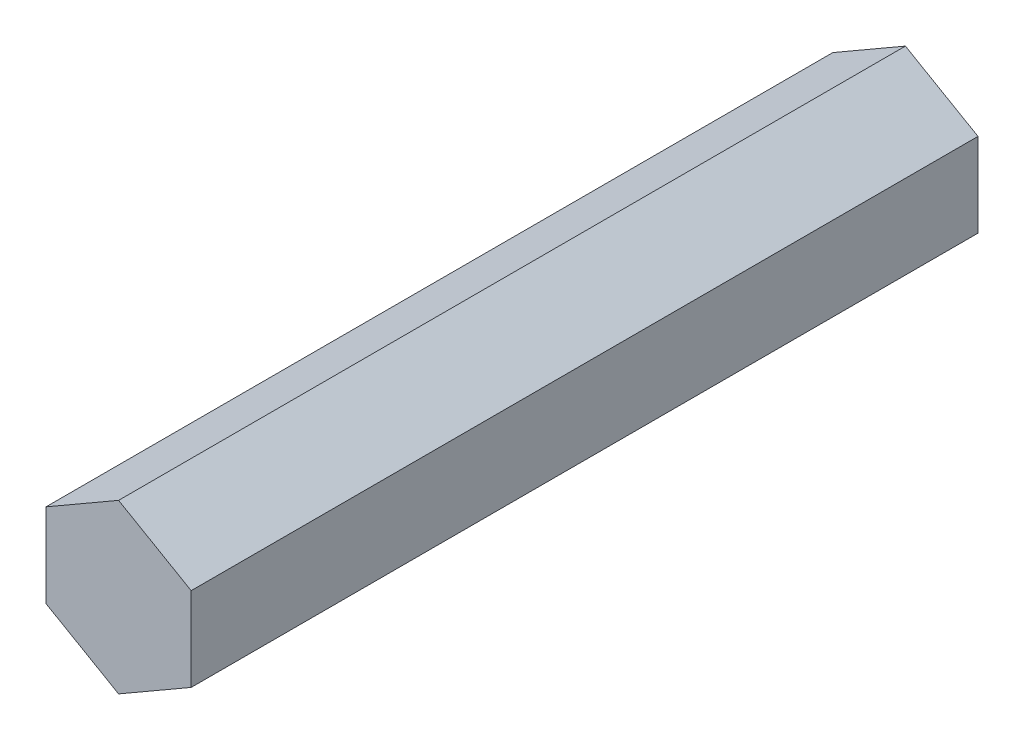
ISO-10303-21;
HEADER;
FILE_DESCRIPTION(('STEP AP214'),'2;1');
FILE_NAME('part.step','',(''),(''),'','','');
FILE_SCHEMA(('AUTOMOTIVE_DESIGN { 1 0 10303 214 1 1 1 1 }'));
ENDSEC;
DATA;
#1=APPLICATION_CONTEXT('core data for automotive mechanical design processes');
#2=APPLICATION_PROTOCOL_DEFINITION('international standard','automotive_design',2000,#1);
#3=PRODUCT_CONTEXT('',#1,'mechanical');
#4=PRODUCT('Part','Part','',(#3));
#5=PRODUCT_RELATED_PRODUCT_CATEGORY('part','',(#4));
#6=PRODUCT_DEFINITION_FORMATION('','',#4);
#7=PRODUCT_DEFINITION_CONTEXT('part definition',#1,'design');
#8=PRODUCT_DEFINITION('design','',#6,#7);
#9=PRODUCT_DEFINITION_SHAPE('','',#8);
#10=(LENGTH_UNIT() NAMED_UNIT(*) SI_UNIT(.MILLI.,.METRE.));
#11=(NAMED_UNIT(*) PLANE_ANGLE_UNIT() SI_UNIT($,.RADIAN.));
#12=(NAMED_UNIT(*) SI_UNIT($,.STERADIAN.) SOLID_ANGLE_UNIT());
#13=UNCERTAINTY_MEASURE_WITH_UNIT(LENGTH_MEASURE(1.E-05),#10,'distance_accuracy_value','');
#14=(GEOMETRIC_REPRESENTATION_CONTEXT(3) GLOBAL_UNCERTAINTY_ASSIGNED_CONTEXT((#13)) GLOBAL_UNIT_ASSIGNED_CONTEXT((#10,
#11,#12)) REPRESENTATION_CONTEXT('',''));
#15=CARTESIAN_POINT('',(0.,0.,0.));
#16=DIRECTION('',(0.,0.,1.));
#17=DIRECTION('',(1.,0.,0.));
#18=AXIS2_PLACEMENT_3D('',#15,#16,#17);
#19=CARTESIAN_POINT('',(0.,7.33234841870825,34.417));
#20=DIRECTION('',(0.5,-0.866025403784439,0.));
#21=DIRECTION('',(0.866025403784439,0.5,0.));
#22=AXIS2_PLACEMENT_3D('',#19,#20,#21);
#23=PLANE('',#22);
#24=DIRECTION('',(-0.866025403784439,-0.5,0.));
#25=VECTOR('',#24,1.);
#26=CARTESIAN_POINT('',(0.,7.33234841870825,-34.417));
#27=LINE('',#26,#25);
#28=CARTESIAN_POINT('',(0.,7.33234841870825,-34.417));
#29=VERTEX_POINT('',#28);
#30=CARTESIAN_POINT('',(-6.35,3.66617420935413,-34.417));
#31=VERTEX_POINT('',#30);
#32=EDGE_CURVE('E140',#29,#31,#27,.T.);
#33=ORIENTED_EDGE('',*,*,#32,.T.);
#34=DIRECTION('',(0.,0.,-1.));
#35=VECTOR('',#34,1.);
#36=CARTESIAN_POINT('',(-6.35,3.66617420935413,34.417));
#37=LINE('',#36,#35);
#38=CARTESIAN_POINT('',(-6.35,3.66617420935413,34.417));
#39=VERTEX_POINT('',#38);
#40=EDGE_CURVE('E11',#39,#31,#37,.T.);
#41=ORIENTED_EDGE('',*,*,#40,.F.);
#42=DIRECTION('',(-0.866025403784439,-0.5,0.));
#43=VECTOR('',#42,1.);
#44=CARTESIAN_POINT('',(0.,7.33234841870825,34.417));
#45=LINE('',#44,#43);
#46=CARTESIAN_POINT('',(0.,7.33234841870825,34.417));
#47=VERTEX_POINT('',#46);
#48=EDGE_CURVE('E153',#47,#39,#45,.T.);
#49=ORIENTED_EDGE('',*,*,#48,.F.);
#50=DIRECTION('',(0.,0.,-1.));
#51=VECTOR('',#50,1.);
#52=CARTESIAN_POINT('',(0.,7.33234841870825,34.417));
#53=LINE('',#52,#51);
#54=EDGE_CURVE('E136',#47,#29,#53,.T.);
#55=ORIENTED_EDGE('',*,*,#54,.T.);
#56=EDGE_LOOP('',(#33,#41,#49,#55));
#57=FACE_BOUND('',#56,.T.);
#58=ADVANCED_FACE('F41',(#57),#23,.F.);
#59=CARTESIAN_POINT('',(-6.35,3.66617420935413,34.417));
#60=DIRECTION('',(1.,0.,0.));
#61=DIRECTION('',(0.,1.,0.));
#62=AXIS2_PLACEMENT_3D('',#59,#60,#61);
#63=PLANE('',#62);
#64=DIRECTION('',(0.,-1.,0.));
#65=VECTOR('',#64,1.);
#66=CARTESIAN_POINT('',(-6.35,3.66617420935413,-34.417));
#67=LINE('',#66,#65);
#68=CARTESIAN_POINT('',(-6.35,-3.66617420935412,-34.417));
#69=VERTEX_POINT('',#68);
#70=EDGE_CURVE('E144',#31,#69,#67,.T.);
#71=ORIENTED_EDGE('',*,*,#70,.T.);
#72=DIRECTION('',(0.,0.,-1.));
#73=VECTOR('',#72,1.);
#74=CARTESIAN_POINT('',(-6.35,-3.66617420935412,34.417));
#75=LINE('',#74,#73);
#76=CARTESIAN_POINT('',(-6.35,-3.66617420935412,34.417));
#77=VERTEX_POINT('',#76);
#78=EDGE_CURVE('E50',#77,#69,#75,.T.);
#79=ORIENTED_EDGE('',*,*,#78,.F.);
#80=DIRECTION('',(0.,-1.,0.));
#81=VECTOR('',#80,1.);
#82=CARTESIAN_POINT('',(-6.35,3.66617420935413,34.417));
#83=LINE('',#82,#81);
#84=EDGE_CURVE('E104',#39,#77,#83,.T.);
#85=ORIENTED_EDGE('',*,*,#84,.F.);
#86=ORIENTED_EDGE('',*,*,#40,.T.);
#87=EDGE_LOOP('',(#71,#79,#85,#86));
#88=FACE_BOUND('',#87,.T.);
#89=ADVANCED_FACE('F181',(#88),#63,.F.);
#90=CARTESIAN_POINT('',(-6.35,-3.66617420935412,34.417));
#91=DIRECTION('',(0.5,0.866025403784439,0.));
#92=DIRECTION('',(-0.866025403784439,0.5,0.));
#93=AXIS2_PLACEMENT_3D('',#90,#91,#92);
#94=PLANE('',#93);
#95=DIRECTION('',(0.866025403784439,-0.5,0.));
#96=VECTOR('',#95,1.);
#97=CARTESIAN_POINT('',(-6.35,-3.66617420935412,-34.417));
#98=LINE('',#97,#96);
#99=CARTESIAN_POINT('',(0.,-7.33234841870825,-34.417));
#100=VERTEX_POINT('',#99);
#101=EDGE_CURVE('E146',#69,#100,#98,.T.);
#102=ORIENTED_EDGE('',*,*,#101,.T.);
#103=DIRECTION('',(0.,0.,-1.));
#104=VECTOR('',#103,1.);
#105=CARTESIAN_POINT('',(0.,-7.33234841870825,34.417));
#106=LINE('',#105,#104);
#107=CARTESIAN_POINT('',(0.,-7.33234841870825,34.417));
#108=VERTEX_POINT('',#107);
#109=EDGE_CURVE('E128',#108,#100,#106,.T.);
#110=ORIENTED_EDGE('',*,*,#109,.F.);
#111=DIRECTION('',(0.866025403784439,-0.5,0.));
#112=VECTOR('',#111,1.);
#113=CARTESIAN_POINT('',(-6.35,-3.66617420935412,34.417));
#114=LINE('',#113,#112);
#115=EDGE_CURVE('E117',#77,#108,#114,.T.);
#116=ORIENTED_EDGE('',*,*,#115,.F.);
#117=ORIENTED_EDGE('',*,*,#78,.T.);
#118=EDGE_LOOP('',(#102,#110,#116,#117));
#119=FACE_BOUND('',#118,.T.);
#120=ADVANCED_FACE('F163',(#119),#94,.F.);
#121=CARTESIAN_POINT('',(0.,-7.33234841870825,34.417));
#122=DIRECTION('',(-0.5,0.866025403784439,0.));
#123=DIRECTION('',(-0.866025403784439,-0.5,0.));
#124=AXIS2_PLACEMENT_3D('',#121,#122,#123);
#125=PLANE('',#124);
#126=DIRECTION('',(0.866025403784439,0.5,0.));
#127=VECTOR('',#126,1.);
#128=CARTESIAN_POINT('',(0.,-7.33234841870825,-34.417));
#129=LINE('',#128,#127);
#130=CARTESIAN_POINT('',(6.35,-3.66617420935413,-34.417));
#131=VERTEX_POINT('',#130);
#132=EDGE_CURVE('E126',#100,#131,#129,.T.);
#133=ORIENTED_EDGE('',*,*,#132,.T.);
#134=DIRECTION('',(0.,0.,-1.));
#135=VECTOR('',#134,1.);
#136=CARTESIAN_POINT('',(6.35,-3.66617420935413,34.417));
#137=LINE('',#136,#135);
#138=CARTESIAN_POINT('',(6.35,-3.66617420935413,34.417));
#139=VERTEX_POINT('',#138);
#140=EDGE_CURVE('E123',#139,#131,#137,.T.);
#141=ORIENTED_EDGE('',*,*,#140,.F.);
#142=DIRECTION('',(0.866025403784439,0.5,0.));
#143=VECTOR('',#142,1.);
#144=CARTESIAN_POINT('',(0.,-7.33234841870825,34.417));
#145=LINE('',#144,#143);
#146=EDGE_CURVE('E111',#108,#139,#145,.T.);
#147=ORIENTED_EDGE('',*,*,#146,.F.);
#148=ORIENTED_EDGE('',*,*,#109,.T.);
#149=EDGE_LOOP('',(#133,#141,#147,#148));
#150=FACE_BOUND('',#149,.T.);
#151=ADVANCED_FACE('F124',(#150),#125,.F.);
#152=CARTESIAN_POINT('',(6.35,-3.66617420935413,34.417));
#153=DIRECTION('',(-1.,0.,0.));
#154=DIRECTION('',(0.,0.,1.));
#155=AXIS2_PLACEMENT_3D('',#152,#153,#154);
#156=PLANE('',#155);
#157=DIRECTION('',(0.,1.,0.));
#158=VECTOR('',#157,1.);
#159=CARTESIAN_POINT('',(6.35,-3.66617420935413,-34.417));
#160=LINE('',#159,#158);
#161=CARTESIAN_POINT('',(6.35,3.66617420935412,-34.417));
#162=VERTEX_POINT('',#161);
#163=EDGE_CURVE('E88',#131,#162,#160,.T.);
#164=ORIENTED_EDGE('',*,*,#163,.T.);
#165=DIRECTION('',(0.,0.,-1.));
#166=VECTOR('',#165,1.);
#167=CARTESIAN_POINT('',(6.35,3.66617420935412,34.417));
#168=LINE('',#167,#166);
#169=CARTESIAN_POINT('',(6.35,3.66617420935412,34.417));
#170=VERTEX_POINT('',#169);
#171=EDGE_CURVE('E129',#170,#162,#168,.T.);
#172=ORIENTED_EDGE('',*,*,#171,.F.);
#173=DIRECTION('',(0.,1.,0.));
#174=VECTOR('',#173,1.);
#175=CARTESIAN_POINT('',(6.35,-3.66617420935413,34.417));
#176=LINE('',#175,#174);
#177=EDGE_CURVE('E115',#139,#170,#176,.T.);
#178=ORIENTED_EDGE('',*,*,#177,.F.);
#179=ORIENTED_EDGE('',*,*,#140,.T.);
#180=EDGE_LOOP('',(#164,#172,#178,#179));
#181=FACE_BOUND('',#180,.T.);
#182=ADVANCED_FACE('F131',(#181),#156,.F.);
#183=CARTESIAN_POINT('',(6.35,3.66617420935412,34.417));
#184=DIRECTION('',(-0.5,-0.866025403784439,0.));
#185=DIRECTION('',(0.866025403784439,-0.5,0.));
#186=AXIS2_PLACEMENT_3D('',#183,#184,#185);
#187=PLANE('',#186);
#188=DIRECTION('',(-0.866025403784439,0.5,0.));
#189=VECTOR('',#188,1.);
#190=CARTESIAN_POINT('',(6.35,3.66617420935412,-34.417));
#191=LINE('',#190,#189);
#192=EDGE_CURVE('E95',#162,#29,#191,.T.);
#193=ORIENTED_EDGE('',*,*,#192,.T.);
#194=ORIENTED_EDGE('',*,*,#54,.F.);
#195=DIRECTION('',(-0.866025403784439,0.5,0.));
#196=VECTOR('',#195,1.);
#197=CARTESIAN_POINT('',(6.35,3.66617420935412,34.417));
#198=LINE('',#197,#196);
#199=EDGE_CURVE('E61',#170,#47,#198,.T.);
#200=ORIENTED_EDGE('',*,*,#199,.F.);
#201=ORIENTED_EDGE('',*,*,#171,.T.);
#202=EDGE_LOOP('',(#193,#194,#200,#201));
#203=FACE_BOUND('',#202,.T.);
#204=ADVANCED_FACE('F170',(#203),#187,.F.);
#205=CARTESIAN_POINT('',(0.,0.,34.417));
#206=DIRECTION('',(0.,0.,1.));
#207=DIRECTION('',(1.,0.,0.));
#208=AXIS2_PLACEMENT_3D('',#205,#206,#207);
#209=PLANE('',#208);
#210=ORIENTED_EDGE('',*,*,#48,.T.);
#211=ORIENTED_EDGE('',*,*,#84,.T.);
#212=ORIENTED_EDGE('',*,*,#115,.T.);
#213=ORIENTED_EDGE('',*,*,#146,.T.);
#214=ORIENTED_EDGE('',*,*,#177,.T.);
#215=ORIENTED_EDGE('',*,*,#199,.T.);
#216=EDGE_LOOP('',(#210,#211,#212,#213,#214,#215));
#217=FACE_BOUND('',#216,.T.);
#218=ADVANCED_FACE('F113',(#217),#209,.T.);
#219=CARTESIAN_POINT('',(0.,0.,-34.417));
#220=DIRECTION('',(0.,0.,1.));
#221=DIRECTION('',(1.,0.,0.));
#222=AXIS2_PLACEMENT_3D('',#219,#220,#221);
#223=PLANE('',#222);
#224=ORIENTED_EDGE('',*,*,#32,.F.);
#225=ORIENTED_EDGE('',*,*,#192,.F.);
#226=ORIENTED_EDGE('',*,*,#163,.F.);
#227=ORIENTED_EDGE('',*,*,#132,.F.);
#228=ORIENTED_EDGE('',*,*,#101,.F.);
#229=ORIENTED_EDGE('',*,*,#70,.F.);
#230=EDGE_LOOP('',(#224,#225,#226,#227,#228,#229));
#231=FACE_BOUND('',#230,.T.);
#232=ADVANCED_FACE('F166',(#231),#223,.F.);
#233=CLOSED_SHELL('',(#58,#89,#120,#151,#182,#204,#218,#232));
#234=MANIFOLD_SOLID_BREP('B2',#233);
#235=ADVANCED_BREP_SHAPE_REPRESENTATION('',(#18,#234),#14);
#236=SHAPE_DEFINITION_REPRESENTATION(#9,#235);
ENDSEC;
END-ISO-10303-21;
